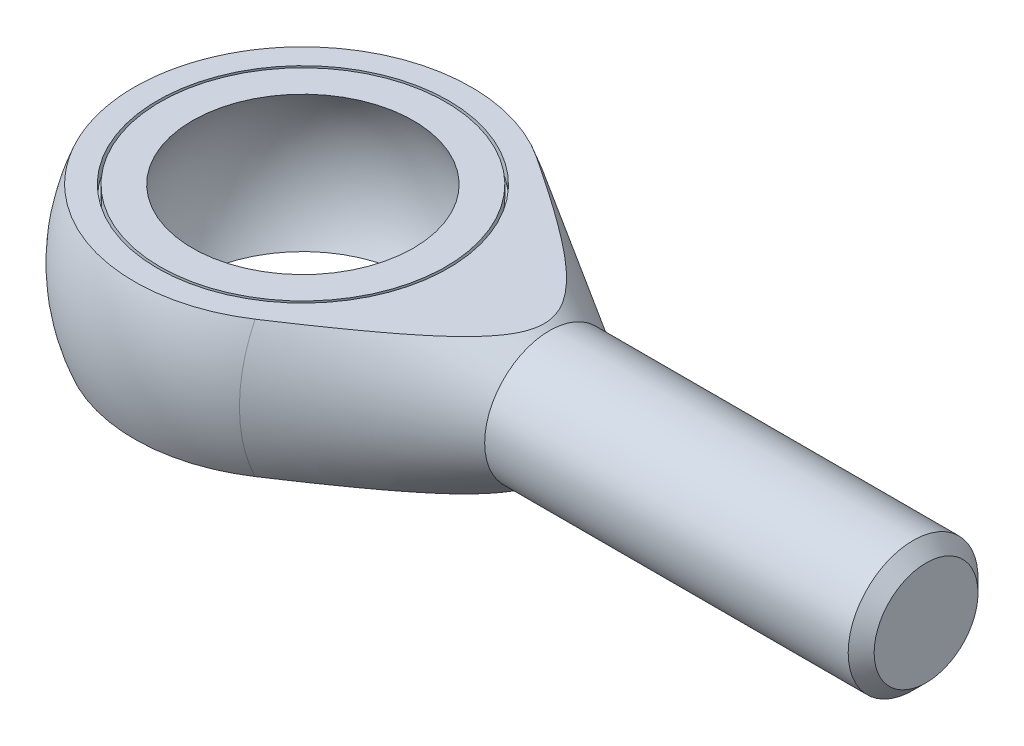
ISO-10303-21;
HEADER;
FILE_DESCRIPTION(('STEP AP214'),'2;1');
FILE_NAME('part.step','',(''),(''),'','','');
FILE_SCHEMA(('AUTOMOTIVE_DESIGN { 1 0 10303 214 1 1 1 1 }'));
ENDSEC;
DATA;
#1=APPLICATION_CONTEXT('core data for automotive mechanical design processes');
#2=APPLICATION_PROTOCOL_DEFINITION('international standard','automotive_design',2000,#1);
#3=PRODUCT_CONTEXT('',#1,'mechanical');
#4=PRODUCT('Part','Part','',(#3));
#5=PRODUCT_RELATED_PRODUCT_CATEGORY('part','',(#4));
#6=PRODUCT_DEFINITION_FORMATION('','',#4);
#7=PRODUCT_DEFINITION_CONTEXT('part definition',#1,'design');
#8=PRODUCT_DEFINITION('design','',#6,#7);
#9=PRODUCT_DEFINITION_SHAPE('','',#8);
#10=(LENGTH_UNIT() NAMED_UNIT(*) SI_UNIT(.MILLI.,.METRE.));
#11=(NAMED_UNIT(*) PLANE_ANGLE_UNIT() SI_UNIT($,.RADIAN.));
#12=(NAMED_UNIT(*) SI_UNIT($,.STERADIAN.) SOLID_ANGLE_UNIT());
#13=UNCERTAINTY_MEASURE_WITH_UNIT(LENGTH_MEASURE(1.E-05),#10,'distance_accuracy_value','');
#14=(GEOMETRIC_REPRESENTATION_CONTEXT(3) GLOBAL_UNCERTAINTY_ASSIGNED_CONTEXT((#13)) GLOBAL_UNIT_ASSIGNED_CONTEXT((#10,
#11,#12)) REPRESENTATION_CONTEXT('',''));
#15=CARTESIAN_POINT('',(0.,0.,0.));
#16=DIRECTION('',(0.,0.,1.));
#17=DIRECTION('',(1.,0.,0.));
#18=AXIS2_PLACEMENT_3D('',#15,#16,#17);
#19=CARTESIAN_POINT('',(-14.,-5.25,-14.));
#20=DIRECTION('',(0.,1.,0.));
#21=DIRECTION('',(-1.,0.,0.));
#22=AXIS2_PLACEMENT_3D('',#19,#20,#21);
#23=PLANE('',#22);
#24=CARTESIAN_POINT('',(-2.62818235817956,-5.25,-17.0529191294828));
#25=CARTESIAN_POINT('',(-2.12503925499544,-5.25,-16.740303282458));
#26=CARTESIAN_POINT('',(-1.62221858295466,-5.25,-16.4271671335793));
#27=CARTESIAN_POINT('',(-0.617367114570737,-5.25,-15.7996232494234));
#28=CARTESIAN_POINT('',(-0.115336323205009,-5.25,-15.4852155061775));
#29=CARTESIAN_POINT('',(0.887915718025678,-5.25,-14.8548186355239));
#30=CARTESIAN_POINT('',(1.38913672077651,-5.25,-14.5388291146458));
#31=CARTESIAN_POINT('',(2.390434330808,-5.25,-13.905043827528));
#32=CARTESIAN_POINT('',(2.89051094079584,-5.25,-13.5872480655673));
#33=CARTESIAN_POINT('',(3.88952679531665,-5.25,-12.949285653447));
#34=CARTESIAN_POINT('',(4.38846528924003,-5.25,-12.6291178270567));
#35=CARTESIAN_POINT('',(5.3845840962432,-5.25,-11.986059462695));
#36=CARTESIAN_POINT('',(5.88176441416815,-5.25,-11.6631689322352));
#37=CARTESIAN_POINT('',(6.87382058369508,-5.25,-11.0140079449249));
#38=CARTESIAN_POINT('',(7.36869673812716,-5.25,-10.6877379515086));
#39=CARTESIAN_POINT('',(8.35552219005812,-5.25,-10.0308094348554));
#40=CARTESIAN_POINT('',(8.84747152387629,-5.25,-9.70015096624085));
#41=CARTESIAN_POINT('',(9.82719732570562,-5.25,-9.0332528700338));
#42=CARTESIAN_POINT('',(10.3149759123961,-5.25,-8.69701636701805));
#43=CARTESIAN_POINT('',(11.042584223956,-5.25,-8.18676697464057));
#44=CARTESIAN_POINT('',(11.2844683213674,-5.25,-8.01568356352145));
#45=CARTESIAN_POINT('',(11.7665787764048,-5.25,-7.67119862410336));
#46=CARTESIAN_POINT('',(12.0068051509764,-5.25,-7.49779711955361));
#47=CARTESIAN_POINT('',(12.4857593495335,-5.25,-7.14785888043862));
#48=CARTESIAN_POINT('',(12.7244828388475,-5.25,-6.97131620446748));
#49=CARTESIAN_POINT('',(13.1994212805954,-5.25,-6.61489315604911));
#50=CARTESIAN_POINT('',(13.4356362927845,-5.25,-6.43501286338981));
#51=CARTESIAN_POINT('',(13.9048300561061,-5.25,-6.07123283389012));
#52=CARTESIAN_POINT('',(14.1378098789113,-5.25,-5.88733448263758));
#53=CARTESIAN_POINT('',(14.5996894514784,-5.25,-5.51449464110692));
#54=CARTESIAN_POINT('',(14.8285894750344,-5.25,-5.32555349139113));
#55=CARTESIAN_POINT('',(15.282237951272,-5.25,-4.94025179508472));
#56=CARTESIAN_POINT('',(15.5069568251484,-5.25,-4.74385630094497));
#57=CARTESIAN_POINT('',(15.9490800000814,-5.25,-4.3426854061068));
#58=CARTESIAN_POINT('',(16.1664805475941,-5.25,-4.13790582106398));
#59=CARTESIAN_POINT('',(16.484175513211,-5.25,-3.82297089010626));
#60=CARTESIAN_POINT('',(16.5885036572486,-5.25,-3.71688406262262));
#61=CARTESIAN_POINT('',(16.7938964577246,-5.25,-3.50160431070215));
#62=CARTESIAN_POINT('',(16.8949614463307,-5.25,-3.39241170455501));
#63=CARTESIAN_POINT('',(17.0930053198843,-5.25,-3.17053617094147));
#64=CARTESIAN_POINT('',(17.1899876198046,-5.25,-3.05785630304538));
#65=CARTESIAN_POINT('',(17.3789511612546,-5.25,-2.82839690184453));
#66=CARTESIAN_POINT('',(17.4709336511534,-5.25,-2.71161840399449));
#67=CARTESIAN_POINT('',(17.6291413848074,-5.25,-2.49944002389789));
#68=CARTESIAN_POINT('',(17.696595836885,-5.25,-2.40495915388657));
#69=CARTESIAN_POINT('',(17.8268589672254,-5.25,-2.21282440774173));
#70=CARTESIAN_POINT('',(17.8896673813928,-5.25,-2.11517035168785));
#71=CARTESIAN_POINT('',(18.009635932278,-5.25,-1.9164265976122));
#72=CARTESIAN_POINT('',(18.0667965305289,-5.25,-1.81533718123305));
#73=CARTESIAN_POINT('',(18.1742438069796,-5.25,-1.6096078237905));
#74=CARTESIAN_POINT('',(18.2245314358917,-5.25,-1.50496837629427));
#75=CARTESIAN_POINT('',(18.3497528940346,-5.25,-1.21600906528184));
#76=CARTESIAN_POINT('',(18.4167302354102,-5.25,-1.02802016789579));
#77=CARTESIAN_POINT('',(18.4930440705706,-5.25,-0.739890839703954));
#78=CARTESIAN_POINT('',(18.5144521575709,-5.25,-0.642871492398333));
#79=CARTESIAN_POINT('',(18.5484628500599,-5.25,-0.447270685231269));
#80=CARTESIAN_POINT('',(18.5610658926043,-5.25,-0.348689303152924));
#81=CARTESIAN_POINT('',(18.5769635243127,-5.25,-0.150015657254014));
#82=CARTESIAN_POINT('',(18.5801863158179,-5.25,-0.0499176044822042));
#83=CARTESIAN_POINT('',(18.5769714195661,-5.25,0.150120621250944));
#84=CARTESIAN_POINT('',(18.5705338544787,-5.25,0.250060796200922));
#85=CARTESIAN_POINT('',(18.5482916604935,-5.25,0.44891994571496));
#86=CARTESIAN_POINT('',(18.5324834582833,-5.25,0.54783851606183));
#87=CARTESIAN_POINT('',(18.4921752626354,-5.25,0.743880072769976));
#88=CARTESIAN_POINT('',(18.4676738423316,-5.25,0.841002761608293));
#89=CARTESIAN_POINT('',(18.4030178370912,-5.25,1.05951947659546));
#90=CARTESIAN_POINT('',(18.360407363697,-5.25,1.18018551122314));
#91=CARTESIAN_POINT('',(18.2645531151317,-5.25,1.41723280305831));
#92=CARTESIAN_POINT('',(18.2113025185034,-5.25,1.5336112544834));
#93=CARTESIAN_POINT('',(18.0959496874158,-5.25,1.76234613587608));
#94=CARTESIAN_POINT('',(18.0338181448365,-5.25,1.8746876430235));
#95=CARTESIAN_POINT('',(17.9025326089589,-5.25,2.095123692322));
#96=CARTESIAN_POINT('',(17.8333797170092,-5.25,2.20321889685798));
#97=CARTESIAN_POINT('',(17.6573498992889,-5.25,2.46282784370737));
#98=CARTESIAN_POINT('',(17.5473864507267,-5.25,2.61224250439258));
#99=CARTESIAN_POINT('',(17.3186817963039,-5.25,2.9042315509107));
#100=CARTESIAN_POINT('',(17.1999358030278,-5.25,3.04680213512871));
#101=CARTESIAN_POINT('',(16.9555901353059,-5.25,3.32643804958606));
#102=CARTESIAN_POINT('',(16.8299765619883,-5.25,3.46349116141572));
#103=CARTESIAN_POINT('',(16.5736806662698,-5.25,3.73269293974768));
#104=CARTESIAN_POINT('',(16.4429993375533,-5.25,3.86484255788085));
#105=CARTESIAN_POINT('',(16.1759566610267,-5.25,4.12669787579271));
#106=CARTESIAN_POINT('',(16.0395443093411,-5.25,4.25635135774169));
#107=CARTESIAN_POINT('',(15.7634463943519,-5.25,4.51212441398327));
#108=CARTESIAN_POINT('',(15.6237606979427,-5.25,4.63824384410948));
#109=CARTESIAN_POINT('',(15.3419298093293,-5.25,4.8873101582602));
#110=CARTESIAN_POINT('',(15.1997881764243,-5.25,5.01026107978952));
#111=CARTESIAN_POINT('',(14.9133363689628,-5.25,5.25359292827943));
#112=CARTESIAN_POINT('',(14.769026281115,-5.25,5.37397395753738));
#113=CARTESIAN_POINT('',(14.4477350601348,-5.25,5.63787621994563));
#114=CARTESIAN_POINT('',(14.2703280946363,-5.25,5.78087853406915));
#115=CARTESIAN_POINT('',(13.9133412580273,-5.25,6.0641479750078));
#116=CARTESIAN_POINT('',(13.7337613250484,-5.25,6.20441502364662));
#117=CARTESIAN_POINT('',(13.1923063020175,-5.25,6.62177574528827));
#118=CARTESIAN_POINT('',(12.8277547678615,-5.25,6.89539748447187));
#119=CARTESIAN_POINT('',(12.0934702302581,-5.25,7.4359017097799));
#120=CARTESIAN_POINT('',(11.7237349982163,-5.25,7.70278114989576));
#121=CARTESIAN_POINT('',(10.9805280997887,-5.25,8.2312963803654));
#122=CARTESIAN_POINT('',(10.6070563383385,-5.25,8.49293203679625));
#123=CARTESIAN_POINT('',(9.85639903737001,-5.25,9.01270604814966));
#124=CARTESIAN_POINT('',(9.47920685092815,-5.25,9.27083478277498));
#125=CARTESIAN_POINT('',(8.72259081692942,-5.25,9.78380733628525));
#126=CARTESIAN_POINT('',(8.34316693940603,-5.25,10.0386511109134));
#127=CARTESIAN_POINT('',(7.58265098105799,-5.25,10.5456024384322));
#128=CARTESIAN_POINT('',(7.20155939730992,-5.25,10.7977107378063));
#129=CARTESIAN_POINT('',(6.43793449283945,-5.25,11.2997341533576));
#130=CARTESIAN_POINT('',(6.05540116898126,-5.25,11.5496492647606));
#131=CARTESIAN_POINT('',(4.99343088142394,-5.25,12.2398634735995));
#132=CARTESIAN_POINT('',(4.31273060646974,-5.25,12.67821851924));
#133=CARTESIAN_POINT('',(2.94857560369635,-5.25,13.5507372381671));
#134=CARTESIAN_POINT('',(2.2651206545807,-5.25,13.9849005648002));
#135=CARTESIAN_POINT('',(0.899005973709454,-5.25,14.8482114756042));
#136=CARTESIAN_POINT('',(0.216354652490301,-5.25,15.2773723802271));
#137=CARTESIAN_POINT('',(-1.15047237131164,-5.25,16.1331105629131));
#138=CARTESIAN_POINT('',(-1.83464791706178,-5.25,16.5596880913868));
#139=CARTESIAN_POINT('',(-2.51940505629375,-5.25,16.9853239876288));
#140=B_SPLINE_CURVE_WITH_KNOTS('',3,(#24,#25,#26,#27,#28,#29,#30,#31,#32,#33,#34,#35,#36,#37,
#38,#39,#40,#41,#42,#43,#44,#45,#46,#47,#48,#49,#50,#51,#52,#53,#54,#55,#56,#57,#58,#59,#60,#61,
#62,#63,#64,#65,#66,#67,#68,#69,#70,#71,#72,#73,#74,#75,#76,#77,#78,#79,#80,#81,#82,#83,#84,#85,
#86,#87,#88,#89,#90,#91,#92,#93,#94,#95,#96,#97,#98,#99,#100,#101,#102,#103,#104,#105,#106,#107,
#108,#109,#110,#111,#112,#113,#114,#115,#116,#117,#118,#119,#120,#121,#122,#123,#124,#125,#126,
#127,#128,#129,#130,#131,#132,#133,#134,#135,#136,#137,#138,#139),.UNSPECIFIED.,.F.,.F.,(4,2,2,
2,2,2,2,2,2,2,2,2,2,2,2,2,2,2,2,2,2,2,2,2,2,2,2,2,2,2,2,2,2,2,2,2,2,2,2,2,2,2,2,2,2,2,2,2,2,2,2,
2,2,2,2,2,2,4),(0.,1.77705867525193,3.55412850410732,5.33166484098367,7.1091969685531,
8.88767899646891,10.6661561194538,12.4443925020109,14.222606771986,15.9998565154504,
16.888663635955,17.7774616574648,18.6681714167051,19.5588599103007,20.4492459606338,
21.3395720306826,22.2347709687872,23.1304222643625,23.5767423874506,24.0230169339339,
24.4689104590565,24.9146921357371,25.2628458954984,25.6110194302212,25.9591644890214,
26.3072613413689,26.9032888932806,27.201016684591,27.4987296965497,27.7987155262954,
28.0986975467798,28.3987940332906,28.6989397991018,29.0822160341973,29.4657387833532,
29.8505577463786,30.2353164407978,30.7914004098707,31.3477897698923,31.9053501578489,
32.4628017668784,33.0273200934349,33.5918614152522,34.1556437112237,34.7194035232227,
35.4029674555354,36.086550896162,37.4538676290173,38.8217914190748,40.1897501006391,
41.5609109641764,42.9320902815018,44.3028854988715,45.6736836994411,48.1025633447862,
50.5316421659497,52.950670300135,55.3694600757206),.UNSPECIFIED.);
#141=CARTESIAN_POINT('',(7.14797043355877,-5.25,10.832544423217));
#142=VERTEX_POINT('',#141);
#143=CARTESIAN_POINT('',(7.14797043355877,-5.25,-10.832544423217));
#144=VERTEX_POINT('',#143);
#145=EDGE_CURVE('E59',#142,#144,#140,.F.);
#146=ORIENTED_EDGE('',*,*,#145,.F.);
#147=CARTESIAN_POINT('',(0.,-5.25,0.));
#148=DIRECTION('',(0.,1.,0.));
#149=DIRECTION('',(-1.,0.,0.));
#150=AXIS2_PLACEMENT_3D('',#147,#148,#149);
#151=CIRCLE('',#150,12.9783473524174);
#152=EDGE_CURVE('E46',#144,#142,#151,.T.);
#153=ORIENTED_EDGE('',*,*,#152,.F.);
#154=EDGE_LOOP('',(#146,#153));
#155=FACE_BOUND('',#154,.T.);
#156=CARTESIAN_POINT('',(0.,-5.25,0.));
#157=DIRECTION('',(0.,1.,0.));
#158=DIRECTION('',(0.,0.,1.));
#159=AXIS2_PLACEMENT_3D('',#156,#157,#158);
#160=CIRCLE('',#159,11.2);
#161=CARTESIAN_POINT('',(0.,-5.25,11.2));
#162=VERTEX_POINT('',#161);
#163=EDGE_CURVE('E158',#162,#162,#160,.T.);
#164=ORIENTED_EDGE('',*,*,#163,.T.);
#165=EDGE_LOOP('',(#164));
#166=FACE_BOUND('',#165,.T.);
#167=ADVANCED_FACE('F32',(#155,#166),#23,.F.);
#168=CARTESIAN_POINT('',(0.,-5.25,0.));
#169=DIRECTION('',(0.,1.,0.));
#170=DIRECTION('',(-1.,0.,0.));
#171=AXIS2_PLACEMENT_3D('',#168,#169,#170);
#172=CIRCLE('',#171,8.5110222652746);
#173=CARTESIAN_POINT('',(8.5110222652746,-5.25,0.));
#174=VERTEX_POINT('',#173);
#175=EDGE_CURVE('E139',#174,#174,#172,.F.);
#176=ORIENTED_EDGE('',*,*,#175,.F.);
#177=EDGE_LOOP('',(#176));
#178=FACE_BOUND('',#177,.T.);
#179=CARTESIAN_POINT('',(0.,-5.25,0.));
#180=DIRECTION('',(0.,1.,0.));
#181=DIRECTION('',(0.,0.,1.));
#182=AXIS2_PLACEMENT_3D('',#179,#180,#181);
#183=CIRCLE('',#182,11.);
#184=CARTESIAN_POINT('',(0.,-5.25,11.));
#185=VERTEX_POINT('',#184);
#186=EDGE_CURVE('E167',#185,#185,#183,.T.);
#187=ORIENTED_EDGE('',*,*,#186,.F.);
#188=EDGE_LOOP('',(#187));
#189=FACE_BOUND('',#188,.T.);
#190=ADVANCED_FACE('F92',(#178,#189),#23,.F.);
#191=CARTESIAN_POINT('',(-14.,5.25,-14.));
#192=DIRECTION('',(0.,-1.,0.));
#193=DIRECTION('',(1.,0.,0.));
#194=AXIS2_PLACEMENT_3D('',#191,#192,#193);
#195=PLANE('',#194);
#196=CARTESIAN_POINT('',(0.,5.25,0.));
#197=DIRECTION('',(0.,-1.,0.));
#198=DIRECTION('',(1.,0.,0.));
#199=AXIS2_PLACEMENT_3D('',#196,#197,#198);
#200=CIRCLE('',#199,8.5110222652746);
#201=CARTESIAN_POINT('',(8.5110222652746,5.25,0.));
#202=VERTEX_POINT('',#201);
#203=EDGE_CURVE('E69',#202,#202,#200,.F.);
#204=ORIENTED_EDGE('',*,*,#203,.F.);
#205=EDGE_LOOP('',(#204));
#206=FACE_BOUND('',#205,.T.);
#207=CARTESIAN_POINT('',(0.,5.25,0.));
#208=DIRECTION('',(0.,1.,0.));
#209=DIRECTION('',(0.,0.,1.));
#210=AXIS2_PLACEMENT_3D('',#207,#208,#209);
#211=CIRCLE('',#210,11.);
#212=CARTESIAN_POINT('',(0.,5.25,11.));
#213=VERTEX_POINT('',#212);
#214=EDGE_CURVE('E155',#213,#213,#211,.T.);
#215=ORIENTED_EDGE('',*,*,#214,.T.);
#216=EDGE_LOOP('',(#215));
#217=FACE_BOUND('',#216,.T.);
#218=ADVANCED_FACE('F88',(#206,#217),#195,.F.);
#219=CARTESIAN_POINT('',(-2.62818235817956,5.25,-17.0529191294828));
#220=CARTESIAN_POINT('',(-2.12503925499544,5.25,-16.740303282458));
#221=CARTESIAN_POINT('',(-1.62221858295466,5.25,-16.4271671335793));
#222=CARTESIAN_POINT('',(-0.617367114570737,5.25,-15.7996232494234));
#223=CARTESIAN_POINT('',(-0.115336323205009,5.25,-15.4852155061775));
#224=CARTESIAN_POINT('',(0.887915718025678,5.25,-14.8548186355239));
#225=CARTESIAN_POINT('',(1.38913672077651,5.25,-14.5388291146458));
#226=CARTESIAN_POINT('',(2.390434330808,5.25,-13.905043827528));
#227=CARTESIAN_POINT('',(2.89051094079584,5.25,-13.5872480655673));
#228=CARTESIAN_POINT('',(3.88952679531665,5.25,-12.949285653447));
#229=CARTESIAN_POINT('',(4.38846528924003,5.25,-12.6291178270567));
#230=CARTESIAN_POINT('',(5.3845840962432,5.25,-11.986059462695));
#231=CARTESIAN_POINT('',(5.88176441416815,5.25,-11.6631689322352));
#232=CARTESIAN_POINT('',(6.87382058369508,5.25,-11.0140079449249));
#233=CARTESIAN_POINT('',(7.36869673812716,5.25,-10.6877379515086));
#234=CARTESIAN_POINT('',(8.35552219005812,5.25,-10.0308094348554));
#235=CARTESIAN_POINT('',(8.84747152387629,5.25,-9.70015096624085));
#236=CARTESIAN_POINT('',(9.82719732570562,5.25,-9.0332528700338));
#237=CARTESIAN_POINT('',(10.3149759123961,5.25,-8.69701636701805));
#238=CARTESIAN_POINT('',(11.042584223956,5.25,-8.18676697464057));
#239=CARTESIAN_POINT('',(11.2844683213674,5.25,-8.01568356352145));
#240=CARTESIAN_POINT('',(11.7665787764048,5.25,-7.67119862410336));
#241=CARTESIAN_POINT('',(12.0068051509764,5.25,-7.49779711955361));
#242=CARTESIAN_POINT('',(12.4857593495335,5.25,-7.14785888043862));
#243=CARTESIAN_POINT('',(12.7244828388475,5.25,-6.97131620446748));
#244=CARTESIAN_POINT('',(13.1994212805954,5.25,-6.61489315604911));
#245=CARTESIAN_POINT('',(13.4356362927845,5.25,-6.43501286338981));
#246=CARTESIAN_POINT('',(13.9048300561061,5.25,-6.07123283389012));
#247=CARTESIAN_POINT('',(14.1378098789113,5.25,-5.88733448263758));
#248=CARTESIAN_POINT('',(14.5996894514784,5.25,-5.51449464110692));
#249=CARTESIAN_POINT('',(14.8285894750344,5.25,-5.32555349139113));
#250=CARTESIAN_POINT('',(15.282237951272,5.25,-4.94025179508472));
#251=CARTESIAN_POINT('',(15.5069568251484,5.25,-4.74385630094497));
#252=CARTESIAN_POINT('',(15.9490800000814,5.25,-4.3426854061068));
#253=CARTESIAN_POINT('',(16.1664805475941,5.25,-4.13790582106398));
#254=CARTESIAN_POINT('',(16.484175513211,5.25,-3.82297089010626));
#255=CARTESIAN_POINT('',(16.5885036572486,5.25,-3.71688406262262));
#256=CARTESIAN_POINT('',(16.7938964577246,5.25,-3.50160431070215));
#257=CARTESIAN_POINT('',(16.8949614463307,5.25,-3.39241170455501));
#258=CARTESIAN_POINT('',(17.0930053198843,5.25,-3.17053617094147));
#259=CARTESIAN_POINT('',(17.1899876198046,5.25,-3.05785630304538));
#260=CARTESIAN_POINT('',(17.3789511612546,5.25,-2.82839690184453));
#261=CARTESIAN_POINT('',(17.4709336511534,5.25,-2.71161840399449));
#262=CARTESIAN_POINT('',(17.6291413848074,5.25,-2.49944002389789));
#263=CARTESIAN_POINT('',(17.696595836885,5.25,-2.40495915388657));
#264=CARTESIAN_POINT('',(17.8268589672254,5.25,-2.21282440774173));
#265=CARTESIAN_POINT('',(17.8896673813928,5.25,-2.11517035168785));
#266=CARTESIAN_POINT('',(18.009635932278,5.25,-1.9164265976122));
#267=CARTESIAN_POINT('',(18.0667965305289,5.25,-1.81533718123305));
#268=CARTESIAN_POINT('',(18.1742438069796,5.25,-1.6096078237905));
#269=CARTESIAN_POINT('',(18.2245314358917,5.25,-1.50496837629427));
#270=CARTESIAN_POINT('',(18.3497528940346,5.25,-1.21600906528184));
#271=CARTESIAN_POINT('',(18.4167302354102,5.25,-1.02802016789579));
#272=CARTESIAN_POINT('',(18.4930440705706,5.25,-0.739890839703954));
#273=CARTESIAN_POINT('',(18.5144521575709,5.25,-0.642871492398333));
#274=CARTESIAN_POINT('',(18.5484628500599,5.25,-0.447270685231269));
#275=CARTESIAN_POINT('',(18.5610658926043,5.25,-0.348689303152924));
#276=CARTESIAN_POINT('',(18.5769635243127,5.25,-0.150015657254014));
#277=CARTESIAN_POINT('',(18.5801863158179,5.25,-0.0499176044822042));
#278=CARTESIAN_POINT('',(18.5769714195661,5.25,0.150120621250944));
#279=CARTESIAN_POINT('',(18.5705338544787,5.25,0.250060796200922));
#280=CARTESIAN_POINT('',(18.5482916604935,5.25,0.44891994571496));
#281=CARTESIAN_POINT('',(18.5324834582833,5.25,0.54783851606183));
#282=CARTESIAN_POINT('',(18.4921752626354,5.25,0.743880072769976));
#283=CARTESIAN_POINT('',(18.4676738423316,5.25,0.841002761608293));
#284=CARTESIAN_POINT('',(18.4030178370912,5.25,1.05951947659546));
#285=CARTESIAN_POINT('',(18.360407363697,5.25,1.18018551122314));
#286=CARTESIAN_POINT('',(18.2645531151317,5.25,1.41723280305831));
#287=CARTESIAN_POINT('',(18.2113025185034,5.25,1.5336112544834));
#288=CARTESIAN_POINT('',(18.0959496874158,5.25,1.76234613587608));
#289=CARTESIAN_POINT('',(18.0338181448365,5.25,1.8746876430235));
#290=CARTESIAN_POINT('',(17.9025326089589,5.25,2.095123692322));
#291=CARTESIAN_POINT('',(17.8333797170092,5.25,2.20321889685798));
#292=CARTESIAN_POINT('',(17.6573498992889,5.25,2.46282784370737));
#293=CARTESIAN_POINT('',(17.5473864507267,5.25,2.61224250439258));
#294=CARTESIAN_POINT('',(17.3186817963039,5.25,2.9042315509107));
#295=CARTESIAN_POINT('',(17.1999358030278,5.25,3.04680213512871));
#296=CARTESIAN_POINT('',(16.9555901353059,5.25,3.32643804958606));
#297=CARTESIAN_POINT('',(16.8299765619883,5.25,3.46349116141572));
#298=CARTESIAN_POINT('',(16.5736806662698,5.25,3.73269293974768));
#299=CARTESIAN_POINT('',(16.4429993375533,5.25,3.86484255788085));
#300=CARTESIAN_POINT('',(16.1759566610267,5.25,4.12669787579271));
#301=CARTESIAN_POINT('',(16.0395443093411,5.25,4.25635135774169));
#302=CARTESIAN_POINT('',(15.7634463943519,5.25,4.51212441398327));
#303=CARTESIAN_POINT('',(15.6237606979427,5.25,4.63824384410948));
#304=CARTESIAN_POINT('',(15.3419298093293,5.25,4.8873101582602));
#305=CARTESIAN_POINT('',(15.1997881764243,5.25,5.01026107978952));
#306=CARTESIAN_POINT('',(14.9133363689628,5.25,5.25359292827943));
#307=CARTESIAN_POINT('',(14.769026281115,5.25,5.37397395753738));
#308=CARTESIAN_POINT('',(14.4477350601348,5.25,5.63787621994563));
#309=CARTESIAN_POINT('',(14.2703280946363,5.25,5.78087853406915));
#310=CARTESIAN_POINT('',(13.9133412580273,5.25,6.0641479750078));
#311=CARTESIAN_POINT('',(13.7337613250484,5.25,6.20441502364662));
#312=CARTESIAN_POINT('',(13.1923063020175,5.25,6.62177574528827));
#313=CARTESIAN_POINT('',(12.8277547678615,5.25,6.89539748447187));
#314=CARTESIAN_POINT('',(12.0934702302581,5.25,7.4359017097799));
#315=CARTESIAN_POINT('',(11.7237349982163,5.25,7.70278114989576));
#316=CARTESIAN_POINT('',(10.9805280997887,5.25,8.2312963803654));
#317=CARTESIAN_POINT('',(10.6070563383385,5.25,8.49293203679625));
#318=CARTESIAN_POINT('',(9.85639903737001,5.25,9.01270604814966));
#319=CARTESIAN_POINT('',(9.47920685092815,5.25,9.27083478277498));
#320=CARTESIAN_POINT('',(8.72259081692942,5.25,9.78380733628525));
#321=CARTESIAN_POINT('',(8.34316693940603,5.25,10.0386511109134));
#322=CARTESIAN_POINT('',(7.58265098105799,5.25,10.5456024384322));
#323=CARTESIAN_POINT('',(7.20155939730992,5.25,10.7977107378063));
#324=CARTESIAN_POINT('',(6.43793449283945,5.25,11.2997341533576));
#325=CARTESIAN_POINT('',(6.05540116898126,5.25,11.5496492647606));
#326=CARTESIAN_POINT('',(4.99343088142394,5.25,12.2398634735995));
#327=CARTESIAN_POINT('',(4.31273060646974,5.25,12.67821851924));
#328=CARTESIAN_POINT('',(2.94857560369635,5.25,13.5507372381671));
#329=CARTESIAN_POINT('',(2.2651206545807,5.25,13.9849005648002));
#330=CARTESIAN_POINT('',(0.899005973709454,5.25,14.8482114756042));
#331=CARTESIAN_POINT('',(0.216354652490301,5.25,15.2773723802271));
#332=CARTESIAN_POINT('',(-1.15047237131164,5.25,16.1331105629131));
#333=CARTESIAN_POINT('',(-1.83464791706178,5.25,16.5596880913868));
#334=CARTESIAN_POINT('',(-2.51940505629375,5.25,16.9853239876288));
#335=B_SPLINE_CURVE_WITH_KNOTS('',3,(#219,#220,#221,#222,#223,#224,#225,#226,#227,#228,#229,
#230,#231,#232,#233,#234,#235,#236,#237,#238,#239,#240,#241,#242,#243,#244,#245,#246,#247,#248,
#249,#250,#251,#252,#253,#254,#255,#256,#257,#258,#259,#260,#261,#262,#263,#264,#265,#266,#267,
#268,#269,#270,#271,#272,#273,#274,#275,#276,#277,#278,#279,#280,#281,#282,#283,#284,#285,#286,
#287,#288,#289,#290,#291,#292,#293,#294,#295,#296,#297,#298,#299,#300,#301,#302,#303,#304,#305,
#306,#307,#308,#309,#310,#311,#312,#313,#314,#315,#316,#317,#318,#319,#320,#321,#322,#323,#324,
#325,#326,#327,#328,#329,#330,#331,#332,#333,#334),.UNSPECIFIED.,.F.,.F.,(4,2,2,2,2,2,2,2,2,2,2,
2,2,2,2,2,2,2,2,2,2,2,2,2,2,2,2,2,2,2,2,2,2,2,2,2,2,2,2,2,2,2,2,2,2,2,2,2,2,2,2,2,2,2,2,2,2,4),
(0.,1.77705867525193,3.55412850410732,5.33166484098367,7.1091969685531,8.88767899646891,
10.6661561194538,12.4443925020109,14.222606771986,15.9998565154504,16.888663635955,
17.7774616574648,18.6681714167051,19.5588599103007,20.4492459606338,21.3395720306826,
22.2347709687872,23.1304222643625,23.5767423874506,24.0230169339339,24.4689104590565,
24.9146921357371,25.2628458954984,25.6110194302212,25.9591644890214,26.3072613413689,
26.9032888932806,27.201016684591,27.4987296965497,27.7987155262954,28.0986975467798,
28.3987940332906,28.6989397991018,29.0822160341973,29.4657387833532,29.8505577463786,
30.2353164407978,30.7914004098707,31.3477897698923,31.9053501578489,32.4628017668784,
33.0273200934349,33.5918614152522,34.1556437112237,34.7194035232227,35.4029674555354,
36.086550896162,37.4538676290173,38.8217914190748,40.1897501006391,41.5609109641764,
42.9320902815018,44.3028854988715,45.6736836994411,48.1025633447862,50.5316421659497,
52.950670300135,55.3694600757206),.UNSPECIFIED.);
#336=CARTESIAN_POINT('',(7.14797043355878,5.25,-10.832544423217));
#337=VERTEX_POINT('',#336);
#338=CARTESIAN_POINT('',(7.14797043355877,5.25,10.832544423217));
#339=VERTEX_POINT('',#338);
#340=EDGE_CURVE('E64',#337,#339,#335,.T.);
#341=ORIENTED_EDGE('',*,*,#340,.F.);
#342=CARTESIAN_POINT('',(0.,5.25,0.));
#343=DIRECTION('',(0.,-1.,0.));
#344=DIRECTION('',(1.,0.,0.));
#345=AXIS2_PLACEMENT_3D('',#342,#343,#344);
#346=CIRCLE('',#345,12.9783473524174);
#347=EDGE_CURVE('E68',#339,#337,#346,.T.);
#348=ORIENTED_EDGE('',*,*,#347,.F.);
#349=EDGE_LOOP('',(#341,#348));
#350=FACE_BOUND('',#349,.T.);
#351=CARTESIAN_POINT('',(0.,5.25,0.));
#352=DIRECTION('',(0.,1.,0.));
#353=DIRECTION('',(0.,0.,1.));
#354=AXIS2_PLACEMENT_3D('',#351,#352,#353);
#355=CIRCLE('',#354,11.2);
#356=CARTESIAN_POINT('',(0.,5.25,11.2));
#357=VERTEX_POINT('',#356);
#358=EDGE_CURVE('E150',#357,#357,#355,.T.);
#359=ORIENTED_EDGE('',*,*,#358,.F.);
#360=EDGE_LOOP('',(#359));
#361=FACE_BOUND('',#360,.T.);
#362=ADVANCED_FACE('F91',(#350,#361),#195,.F.);
#363=CARTESIAN_POINT('',(0.,0.,0.));
#364=DIRECTION('',(-1.,0.,0.));
#365=DIRECTION('',(0.,0.,-1.));
#366=AXIS2_PLACEMENT_3D('',#363,#364,#365);
#367=SPHERICAL_SURFACE('',#366,14.);
#368=CARTESIAN_POINT('',(7.14797043355877,0.,0.));
#369=DIRECTION('',(-1.,0.,0.));
#370=DIRECTION('',(0.,0.,1.));
#371=AXIS2_PLACEMENT_3D('',#368,#369,#370);
#372=CIRCLE('',#371,12.0377123524767);
#373=EDGE_CURVE('E67',#337,#144,#372,.T.);
#374=ORIENTED_EDGE('',*,*,#373,.T.);
#375=ORIENTED_EDGE('',*,*,#152,.T.);
#376=EDGE_CURVE('E53',#142,#339,#372,.T.);
#377=ORIENTED_EDGE('',*,*,#376,.T.);
#378=ORIENTED_EDGE('',*,*,#347,.T.);
#379=EDGE_LOOP('',(#374,#375,#377,#378));
#380=FACE_BOUND('',#379,.T.);
#381=ADVANCED_FACE('F66',(#380),#367,.T.);
#382=CARTESIAN_POINT('',(19.,0.,0.));
#383=DIRECTION('',(-1.,0.,0.));
#384=DIRECTION('',(0.,0.,1.));
#385=AXIS2_PLACEMENT_3D('',#382,#383,#384);
#386=CONICAL_SURFACE('',#385,5.,0.535846782161462);
#387=ORIENTED_EDGE('',*,*,#376,.F.);
#388=ORIENTED_EDGE('',*,*,#145,.T.);
#389=ORIENTED_EDGE('',*,*,#373,.F.);
#390=ORIENTED_EDGE('',*,*,#340,.T.);
#391=EDGE_LOOP('',(#387,#388,#389,#390));
#392=FACE_BOUND('',#391,.T.);
#393=CARTESIAN_POINT('',(19.,0.,0.));
#394=DIRECTION('',(1.,0.,0.));
#395=DIRECTION('',(0.,0.,-1.));
#396=AXIS2_PLACEMENT_3D('',#393,#394,#395);
#397=CIRCLE('',#396,5.);
#398=CARTESIAN_POINT('',(19.,0.,5.));
#399=VERTEX_POINT('',#398);
#400=EDGE_CURVE('E170',#399,#399,#397,.T.);
#401=ORIENTED_EDGE('',*,*,#400,.F.);
#402=EDGE_LOOP('',(#401));
#403=FACE_BOUND('',#402,.T.);
#404=ADVANCED_FACE('F72',(#392,#403),#386,.T.);
#405=CARTESIAN_POINT('',(0.,0.,0.));
#406=DIRECTION('',(0.,1.,0.));
#407=DIRECTION('',(1.,0.,0.));
#408=AXIS2_PLACEMENT_3D('',#405,#406,#407);
#409=SPHERICAL_SURFACE('',#408,10.);
#410=CARTESIAN_POINT('',(8.5110222652746,-5.25,0.));
#411=CARTESIAN_POINT('',(8.57147622073668,-5.15199686805598,0.));
#412=CARTESIAN_POINT('',(8.63023597393296,-5.05294873214638,0.));
#413=CARTESIAN_POINT('',(8.74430021425778,-4.85288249220074,0.));
#414=CARTESIAN_POINT('',(8.79960470138633,-4.75186438816471,0.));
#415=CARTESIAN_POINT('',(8.90669154803957,-4.54797825177098,0.));
#416=CARTESIAN_POINT('',(8.95847390756427,-4.44511021941328,0.));
#417=CARTESIAN_POINT('',(9.05845494486029,-4.23764710338871,0.));
#418=CARTESIAN_POINT('',(9.10665362263163,-4.13305201972184,0.));
#419=CARTESIAN_POINT('',(9.19940972237268,-3.9222595700734,0.));
#420=CARTESIAN_POINT('',(9.24396714434239,-3.81606220409182,0.));
#421=CARTESIAN_POINT('',(9.32938758255673,-3.60219191589988,0.));
#422=CARTESIAN_POINT('',(9.37025059880136,-3.49451899368952,0.));
#423=CARTESIAN_POINT('',(9.4482334626182,-3.2778260676683,0.));
#424=CARTESIAN_POINT('',(9.48535331019042,-3.16880606385744,0.));
#425=CARTESIAN_POINT('',(9.55580554582315,-2.94954905987119,0.));
#426=CARTESIAN_POINT('',(9.58913793388367,-2.83931205969579,0.));
#427=CARTESIAN_POINT('',(9.65197547738992,-2.61775259948757,0.));
#428=CARTESIAN_POINT('',(9.68148063283565,-2.50643013945474,0.));
#429=CARTESIAN_POINT('',(9.73662850513809,-2.28283259146126,0.));
#430=CARTESIAN_POINT('',(9.7622712219948,-2.17055750350062,0.));
#431=CARTESIAN_POINT('',(9.80966361976378,-1.94518866821076,0.));
#432=CARTESIAN_POINT('',(9.83141330067605,-1.83209492088156,0.));
#433=CARTESIAN_POINT('',(9.87099367446777,-1.60522371226905,0.));
#434=CARTESIAN_POINT('',(9.88882436734721,-1.49144625098575,0.));
#435=CARTESIAN_POINT('',(9.92054548918118,-1.26334337569434,0.));
#436=CARTESIAN_POINT('',(9.9344359181357,-1.14901796168622,0.));
#437=CARTESIAN_POINT('',(9.95825993782072,-0.919955596002297,0.));
#438=CARTESIAN_POINT('',(9.96819352855123,-0.80521864432649,0.));
#439=CARTESIAN_POINT('',(9.98409201885622,-0.575470109417833,0.));
#440=CARTESIAN_POINT('',(9.99005691843071,-0.460458526184983,0.));
#441=CARTESIAN_POINT('',(9.9980109090026,-0.230297961968088,0.));
#442=CARTESIAN_POINT('',(10.,-0.115148980984044,0.));
#443=CARTESIAN_POINT('',(10.,0.115148980984044,0.));
#444=CARTESIAN_POINT('',(9.9980109090026,0.230297961968088,0.));
#445=CARTESIAN_POINT('',(9.99005691843071,0.460458526184983,0.));
#446=CARTESIAN_POINT('',(9.98409201885622,0.575470109417833,0.));
#447=CARTESIAN_POINT('',(9.96819352855123,0.80521864432649,0.));
#448=CARTESIAN_POINT('',(9.95825993782072,0.919955596002297,0.));
#449=CARTESIAN_POINT('',(9.9344359181357,1.14901796168622,0.));
#450=CARTESIAN_POINT('',(9.92054548918118,1.26334337569434,0.));
#451=CARTESIAN_POINT('',(9.88882436734721,1.49144625098575,0.));
#452=CARTESIAN_POINT('',(9.87099367446777,1.60522371226905,0.));
#453=CARTESIAN_POINT('',(9.83141330067605,1.83209492088156,0.));
#454=CARTESIAN_POINT('',(9.80966361976378,1.94518866821076,0.));
#455=CARTESIAN_POINT('',(9.7622712219948,2.17055750350062,0.));
#456=CARTESIAN_POINT('',(9.73662850513809,2.28283259146126,0.));
#457=CARTESIAN_POINT('',(9.68148063283565,2.50643013945474,0.));
#458=CARTESIAN_POINT('',(9.65197547738992,2.61775259948757,0.));
#459=CARTESIAN_POINT('',(9.58913793388367,2.83931205969579,0.));
#460=CARTESIAN_POINT('',(9.55580554582315,2.94954905987119,0.));
#461=CARTESIAN_POINT('',(9.48535331019042,3.16880606385744,0.));
#462=CARTESIAN_POINT('',(9.4482334626182,3.2778260676683,0.));
#463=CARTESIAN_POINT('',(9.37025059880136,3.49451899368952,0.));
#464=CARTESIAN_POINT('',(9.32938758255673,3.60219191589988,0.));
#465=CARTESIAN_POINT('',(9.24396714434239,3.81606220409182,0.));
#466=CARTESIAN_POINT('',(9.19940972237268,3.9222595700734,0.));
#467=CARTESIAN_POINT('',(9.10665362263163,4.13305201972184,0.));
#468=CARTESIAN_POINT('',(9.05845494486029,4.23764710338871,0.));
#469=CARTESIAN_POINT('',(8.95847390756427,4.44511021941328,0.));
#470=CARTESIAN_POINT('',(8.90669154803957,4.54797825177098,0.));
#471=CARTESIAN_POINT('',(8.79960470138633,4.75186438816471,0.));
#472=CARTESIAN_POINT('',(8.74430021425778,4.85288249220074,0.));
#473=CARTESIAN_POINT('',(8.63023597393296,5.05294873214638,0.));
#474=CARTESIAN_POINT('',(8.57147622073668,5.15199686805598,0.));
#475=CARTESIAN_POINT('',(8.5110222652746,5.25,0.));
#476=B_SPLINE_CURVE_WITH_KNOTS('',3,(#410,#411,#412,#413,#414,#415,#416,#417,#418,#419,#420,
#421,#422,#423,#424,#425,#426,#427,#428,#429,#430,#431,#432,#433,#434,#435,#436,#437,#438,#439,
#440,#441,#442,#443,#444,#445,#446,#447,#448,#449,#450,#451,#452,#453,#454,#455,#456,#457,#458,
#459,#460,#461,#462,#463,#464,#465,#466,#467,#468,#469,#470,#471,#472,#473,#474,#475),
.UNSPECIFIED.,.F.,.F.,(4,2,2,2,2,2,2,2,2,2,2,2,2,2,2,2,2,2,2,2,2,2,2,2,2,2,2,2,2,2,2,2,4),(0.,
0.345429769514631,0.690859539029263,1.03628930854389,1.38171907805853,1.72714884757316,
2.07257861708779,2.41800838660242,2.76343815611705,3.10886792563169,3.45429769514632,
3.79972746466095,4.14515723417558,4.49058700369021,4.83601677320484,5.18144654271948,
5.52687631223411,5.87230608174874,6.21773585126337,6.563165620778,6.90859539029263,
7.25402515980726,7.5994549293219,7.94488469883653,8.29031446835116,8.63574423786579,
8.98117400738042,9.32660377689505,9.67203354640968,10.0174633159243,10.3628930854389,
10.7083228549536,11.0537526244682),.UNSPECIFIED.);
#477=EDGE_CURVE('BSEAM97',#174,#202,#476,.T.);
#478=ORIENTED_EDGE('',*,*,#175,.T.);
#479=ORIENTED_EDGE('',*,*,#203,.T.);
#480=ORIENTED_EDGE('',*,*,#477,.T.);
#481=ORIENTED_EDGE('',*,*,#477,.F.);
#482=EDGE_LOOP('',(#478,#480,#479,#481));
#483=FACE_BOUND('',#482,.T.);
#484=ADVANCED_FACE('F97',(#483),#409,.F.);
#485=CARTESIAN_POINT('',(0.,13.9759981284706,0.));
#486=DIRECTION('',(0.,1.,0.));
#487=DIRECTION('',(0.,0.,1.));
#488=AXIS2_PLACEMENT_3D('',#485,#486,#487);
#489=CYLINDRICAL_SURFACE('',#488,11.);
#490=CARTESIAN_POINT('',(0.,4.25,0.));
#491=DIRECTION('',(0.,1.,0.));
#492=DIRECTION('',(0.,0.,1.));
#493=AXIS2_PLACEMENT_3D('',#490,#491,#492);
#494=CIRCLE('',#493,11.);
#495=CARTESIAN_POINT('',(0.,4.25,11.));
#496=VERTEX_POINT('',#495);
#497=EDGE_CURVE('E141',#496,#496,#494,.T.);
#498=ORIENTED_EDGE('',*,*,#497,.T.);
#499=EDGE_LOOP('',(#498));
#500=FACE_BOUND('',#499,.T.);
#501=ORIENTED_EDGE('',*,*,#214,.F.);
#502=EDGE_LOOP('',(#501));
#503=FACE_BOUND('',#502,.T.);
#504=ADVANCED_FACE('F100',(#500,#503),#489,.T.);
#505=CARTESIAN_POINT('',(11.,4.25,0.));
#506=DIRECTION('',(0.,1.,0.));
#507=DIRECTION('',(0.,0.,1.));
#508=AXIS2_PLACEMENT_3D('',#505,#506,#507);
#509=PLANE('',#508);
#510=CARTESIAN_POINT('',(0.,4.25,0.));
#511=DIRECTION('',(0.,1.,0.));
#512=DIRECTION('',(0.,0.,1.));
#513=AXIS2_PLACEMENT_3D('',#510,#511,#512);
#514=CIRCLE('',#513,11.2);
#515=CARTESIAN_POINT('',(0.,4.25,11.2));
#516=VERTEX_POINT('',#515);
#517=EDGE_CURVE('E146',#516,#516,#514,.T.);
#518=ORIENTED_EDGE('',*,*,#517,.T.);
#519=EDGE_LOOP('',(#518));
#520=FACE_BOUND('',#519,.T.);
#521=ORIENTED_EDGE('',*,*,#497,.F.);
#522=EDGE_LOOP('',(#521));
#523=FACE_BOUND('',#522,.T.);
#524=ADVANCED_FACE('F104',(#520,#523),#509,.T.);
#525=CARTESIAN_POINT('',(0.,13.9759981284706,0.));
#526=DIRECTION('',(0.,1.,0.));
#527=DIRECTION('',(0.,0.,1.));
#528=AXIS2_PLACEMENT_3D('',#525,#526,#527);
#529=CYLINDRICAL_SURFACE('',#528,11.2);
#530=ORIENTED_EDGE('',*,*,#358,.T.);
#531=EDGE_LOOP('',(#530));
#532=FACE_BOUND('',#531,.T.);
#533=ORIENTED_EDGE('',*,*,#517,.F.);
#534=EDGE_LOOP('',(#533));
#535=FACE_BOUND('',#534,.T.);
#536=ADVANCED_FACE('F108',(#532,#535),#529,.F.);
#537=CARTESIAN_POINT('',(0.,13.9759981284706,0.));
#538=DIRECTION('',(0.,1.,0.));
#539=DIRECTION('',(0.,0.,1.));
#540=AXIS2_PLACEMENT_3D('',#537,#538,#539);
#541=CYLINDRICAL_SURFACE('',#540,11.2);
#542=CARTESIAN_POINT('',(0.,-4.25,0.));
#543=DIRECTION('',(0.,1.,0.));
#544=DIRECTION('',(0.,0.,1.));
#545=AXIS2_PLACEMENT_3D('',#542,#543,#544);
#546=CIRCLE('',#545,11.2);
#547=CARTESIAN_POINT('',(0.,-4.25,11.2));
#548=VERTEX_POINT('',#547);
#549=EDGE_CURVE('E161',#548,#548,#546,.T.);
#550=ORIENTED_EDGE('',*,*,#549,.T.);
#551=EDGE_LOOP('',(#550));
#552=FACE_BOUND('',#551,.T.);
#553=ORIENTED_EDGE('',*,*,#163,.F.);
#554=EDGE_LOOP('',(#553));
#555=FACE_BOUND('',#554,.T.);
#556=ADVANCED_FACE('F112',(#552,#555),#541,.F.);
#557=CARTESIAN_POINT('',(11.,-4.25,0.));
#558=DIRECTION('',(0.,-1.,0.));
#559=DIRECTION('',(0.,0.,-1.));
#560=AXIS2_PLACEMENT_3D('',#557,#558,#559);
#561=PLANE('',#560);
#562=CARTESIAN_POINT('',(0.,-4.25,0.));
#563=DIRECTION('',(0.,1.,0.));
#564=DIRECTION('',(0.,0.,1.));
#565=AXIS2_PLACEMENT_3D('',#562,#563,#564);
#566=CIRCLE('',#565,11.);
#567=CARTESIAN_POINT('',(0.,-4.25,11.));
#568=VERTEX_POINT('',#567);
#569=EDGE_CURVE('E164',#568,#568,#566,.T.);
#570=ORIENTED_EDGE('',*,*,#569,.T.);
#571=EDGE_LOOP('',(#570));
#572=FACE_BOUND('',#571,.T.);
#573=ORIENTED_EDGE('',*,*,#549,.F.);
#574=EDGE_LOOP('',(#573));
#575=FACE_BOUND('',#574,.T.);
#576=ADVANCED_FACE('F116',(#572,#575),#561,.T.);
#577=CARTESIAN_POINT('',(0.,13.9759981284706,0.));
#578=DIRECTION('',(0.,1.,0.));
#579=DIRECTION('',(0.,0.,1.));
#580=AXIS2_PLACEMENT_3D('',#577,#578,#579);
#581=CYLINDRICAL_SURFACE('',#580,11.);
#582=ORIENTED_EDGE('',*,*,#186,.T.);
#583=EDGE_LOOP('',(#582));
#584=FACE_BOUND('',#583,.T.);
#585=ORIENTED_EDGE('',*,*,#569,.F.);
#586=EDGE_LOOP('',(#585));
#587=FACE_BOUND('',#586,.T.);
#588=ADVANCED_FACE('F120',(#584,#587),#581,.T.);
#589=CARTESIAN_POINT('',(48.,0.,0.));
#590=DIRECTION('',(-1.,0.,0.));
#591=DIRECTION('',(0.,0.,1.));
#592=AXIS2_PLACEMENT_3D('',#589,#590,#591);
#593=CYLINDRICAL_SURFACE('',#592,5.);
#594=CARTESIAN_POINT('',(47.,0.,0.));
#595=DIRECTION('',(1.,0.,0.));
#596=DIRECTION('',(0.,0.,-1.));
#597=AXIS2_PLACEMENT_3D('',#594,#595,#596);
#598=CIRCLE('',#597,5.);
#599=CARTESIAN_POINT('',(47.,0.,5.));
#600=VERTEX_POINT('',#599);
#601=EDGE_CURVE('E11',#600,#600,#598,.F.);
#602=CARTESIAN_POINT('',(47.,0.,5.));
#603=CARTESIAN_POINT('',(46.7083333333333,0.,5.));
#604=CARTESIAN_POINT('',(46.4166666666667,0.,5.));
#605=CARTESIAN_POINT('',(45.8333333333333,0.,5.));
#606=CARTESIAN_POINT('',(45.5416666666667,0.,5.));
#607=CARTESIAN_POINT('',(44.9583333333333,0.,5.));
#608=CARTESIAN_POINT('',(44.6666666666667,0.,5.));
#609=CARTESIAN_POINT('',(44.0833333333333,0.,5.));
#610=CARTESIAN_POINT('',(43.7916666666667,0.,5.));
#611=CARTESIAN_POINT('',(43.2083333333333,0.,5.));
#612=CARTESIAN_POINT('',(42.9166666666667,0.,5.));
#613=CARTESIAN_POINT('',(42.3333333333333,0.,5.));
#614=CARTESIAN_POINT('',(42.0416666666667,0.,5.));
#615=CARTESIAN_POINT('',(41.4583333333333,0.,5.));
#616=CARTESIAN_POINT('',(41.1666666666667,0.,5.));
#617=CARTESIAN_POINT('',(40.5833333333333,0.,5.));
#618=CARTESIAN_POINT('',(40.2916666666667,0.,5.));
#619=CARTESIAN_POINT('',(39.7083333333333,0.,5.));
#620=CARTESIAN_POINT('',(39.4166666666667,0.,5.));
#621=CARTESIAN_POINT('',(38.8333333333333,0.,5.));
#622=CARTESIAN_POINT('',(38.5416666666667,0.,5.));
#623=CARTESIAN_POINT('',(37.9583333333333,0.,5.));
#624=CARTESIAN_POINT('',(37.6666666666667,0.,5.));
#625=CARTESIAN_POINT('',(37.0833333333333,0.,5.));
#626=CARTESIAN_POINT('',(36.7916666666667,0.,5.));
#627=CARTESIAN_POINT('',(36.2083333333333,0.,5.));
#628=CARTESIAN_POINT('',(35.9166666666667,0.,5.));
#629=CARTESIAN_POINT('',(35.3333333333333,0.,5.));
#630=CARTESIAN_POINT('',(35.0416666666667,0.,5.));
#631=CARTESIAN_POINT('',(34.4583333333333,0.,5.));
#632=CARTESIAN_POINT('',(34.1666666666667,0.,5.));
#633=CARTESIAN_POINT('',(33.5833333333333,0.,5.));
#634=CARTESIAN_POINT('',(33.2916666666667,0.,5.));
#635=CARTESIAN_POINT('',(32.7083333333333,0.,5.));
#636=CARTESIAN_POINT('',(32.4166666666667,0.,5.));
#637=CARTESIAN_POINT('',(31.8333333333333,0.,5.));
#638=CARTESIAN_POINT('',(31.5416666666667,0.,5.));
#639=CARTESIAN_POINT('',(30.9583333333333,0.,5.));
#640=CARTESIAN_POINT('',(30.6666666666667,0.,5.));
#641=CARTESIAN_POINT('',(30.0833333333333,0.,5.));
#642=CARTESIAN_POINT('',(29.7916666666667,0.,5.));
#643=CARTESIAN_POINT('',(29.2083333333333,0.,5.));
#644=CARTESIAN_POINT('',(28.9166666666667,0.,5.));
#645=CARTESIAN_POINT('',(28.3333333333333,0.,5.));
#646=CARTESIAN_POINT('',(28.0416666666667,0.,5.));
#647=CARTESIAN_POINT('',(27.4583333333333,0.,5.));
#648=CARTESIAN_POINT('',(27.1666666666667,0.,5.));
#649=CARTESIAN_POINT('',(26.5833333333333,0.,5.));
#650=CARTESIAN_POINT('',(26.2916666666667,0.,5.));
#651=CARTESIAN_POINT('',(25.7083333333333,0.,5.));
#652=CARTESIAN_POINT('',(25.4166666666667,0.,5.));
#653=CARTESIAN_POINT('',(24.8333333333333,0.,5.));
#654=CARTESIAN_POINT('',(24.5416666666667,0.,5.));
#655=CARTESIAN_POINT('',(23.9583333333333,0.,5.));
#656=CARTESIAN_POINT('',(23.6666666666667,0.,5.));
#657=CARTESIAN_POINT('',(23.0833333333333,0.,5.));
#658=CARTESIAN_POINT('',(22.7916666666667,0.,5.));
#659=CARTESIAN_POINT('',(22.2083333333333,0.,5.));
#660=CARTESIAN_POINT('',(21.9166666666667,0.,5.));
#661=CARTESIAN_POINT('',(21.3333333333333,0.,5.));
#662=CARTESIAN_POINT('',(21.0416666666667,0.,5.));
#663=CARTESIAN_POINT('',(20.4583333333333,0.,5.));
#664=CARTESIAN_POINT('',(20.1666666666667,0.,5.));
#665=CARTESIAN_POINT('',(19.5833333333333,0.,5.));
#666=CARTESIAN_POINT('',(19.2916666666667,0.,5.));
#667=CARTESIAN_POINT('',(19.,0.,5.));
#668=B_SPLINE_CURVE_WITH_KNOTS('',3,(#602,#603,#604,#605,#606,#607,#608,#609,#610,#611,#612,
#613,#614,#615,#616,#617,#618,#619,#620,#621,#622,#623,#624,#625,#626,#627,#628,#629,#630,#631,
#632,#633,#634,#635,#636,#637,#638,#639,#640,#641,#642,#643,#644,#645,#646,#647,#648,#649,#650,
#651,#652,#653,#654,#655,#656,#657,#658,#659,#660,#661,#662,#663,#664,#665,#666,#667),
.UNSPECIFIED.,.F.,.F.,(4,2,2,2,2,2,2,2,2,2,2,2,2,2,2,2,2,2,2,2,2,2,2,2,2,2,2,2,2,2,2,2,4),(0.,
0.875000000000001,1.75,2.625,3.5,4.375,5.25,6.12500000000001,7.00000000000001,7.87500000000001,
8.75000000000001,9.62500000000001,10.5,11.375,12.25,13.125,14.,14.875,15.75,16.625,17.5,18.375,
19.25,20.125,21.,21.875,22.75,23.625,24.5,25.375,26.25,27.125,28.),.UNSPECIFIED.);
#669=EDGE_CURVE('BSEAM124',#600,#399,#668,.T.);
#670=ORIENTED_EDGE('',*,*,#601,.T.);
#671=ORIENTED_EDGE('',*,*,#400,.T.);
#672=ORIENTED_EDGE('',*,*,#669,.T.);
#673=ORIENTED_EDGE('',*,*,#669,.F.);
#674=EDGE_LOOP('',(#670,#672,#671,#673));
#675=FACE_BOUND('',#674,.T.);
#676=ADVANCED_FACE('F124',(#675),#593,.T.);
#677=CARTESIAN_POINT('',(48.,0.,0.));
#678=DIRECTION('',(1.,0.,0.));
#679=DIRECTION('',(0.,0.,-1.));
#680=AXIS2_PLACEMENT_3D('',#677,#678,#679);
#681=PLANE('',#680);
#682=CARTESIAN_POINT('',(48.,0.,0.));
#683=DIRECTION('',(1.,0.,0.));
#684=DIRECTION('',(0.,0.,-1.));
#685=AXIS2_PLACEMENT_3D('',#682,#683,#684);
#686=CIRCLE('',#685,4.00000000000002);
#687=CARTESIAN_POINT('',(48.,0.,-4.00000000000002));
#688=VERTEX_POINT('',#687);
#689=EDGE_CURVE('E40',#688,#688,#686,.T.);
#690=ORIENTED_EDGE('',*,*,#689,.T.);
#691=EDGE_LOOP('',(#690));
#692=FACE_BOUND('',#691,.T.);
#693=ADVANCED_FACE('F128',(#692),#681,.T.);
#694=CARTESIAN_POINT('',(48.,0.,0.));
#695=DIRECTION('',(-1.,0.,0.));
#696=DIRECTION('',(0.,0.,1.));
#697=AXIS2_PLACEMENT_3D('',#694,#695,#696);
#698=CONICAL_SURFACE('',#697,4.00000000000002,0.785398163397447);
#699=ORIENTED_EDGE('',*,*,#601,.F.);
#700=EDGE_LOOP('',(#699));
#701=FACE_BOUND('',#700,.T.);
#702=ORIENTED_EDGE('',*,*,#689,.F.);
#703=EDGE_LOOP('',(#702));
#704=FACE_BOUND('',#703,.T.);
#705=ADVANCED_FACE('F34',(#701,#704),#698,.T.);
#706=CLOSED_SHELL('',(#167,#190,#218,#362,#381,#404,#484,#504,#524,#536,#556,#576,#588,#676,
#693,#705));
#707=MANIFOLD_SOLID_BREP('B2',#706);
#708=ADVANCED_BREP_SHAPE_REPRESENTATION('',(#18,#707),#14);
#709=SHAPE_DEFINITION_REPRESENTATION(#9,#708);
ENDSEC;
END-ISO-10303-21;
